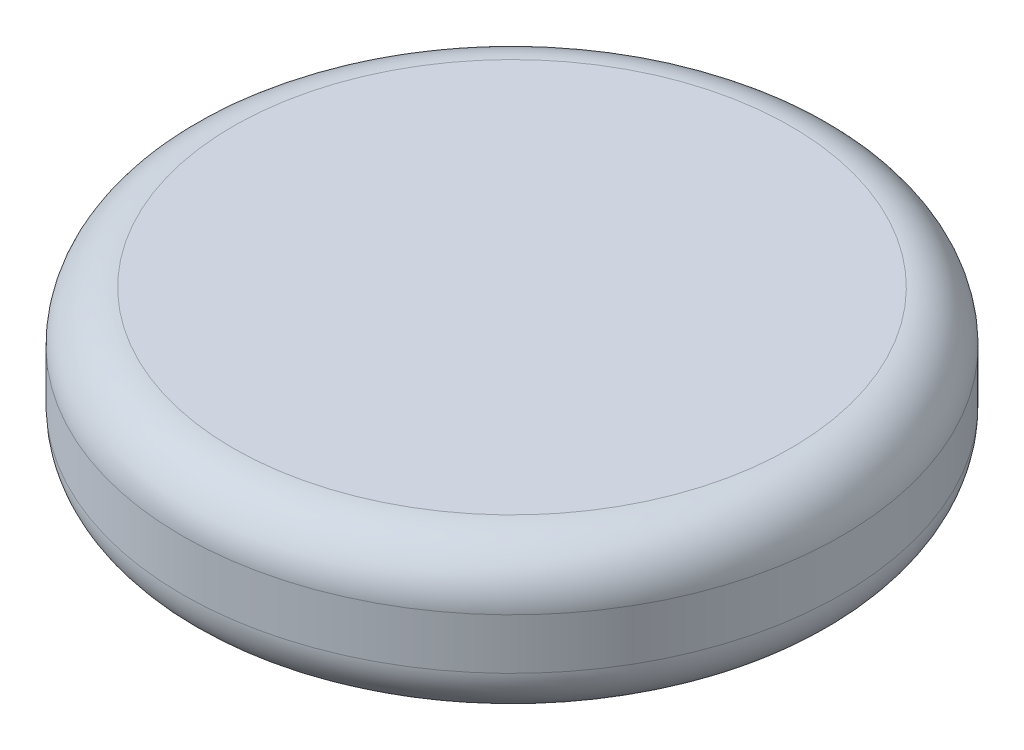
ISO-10303-21;
HEADER;
FILE_DESCRIPTION(('STEP AP214'),'2;1');
FILE_NAME('part.step','',(''),(''),'','','');
FILE_SCHEMA(('AUTOMOTIVE_DESIGN { 1 0 10303 214 1 1 1 1 }'));
ENDSEC;
DATA;
#1=APPLICATION_CONTEXT('core data for automotive mechanical design processes');
#2=APPLICATION_PROTOCOL_DEFINITION('international standard','automotive_design',2000,#1);
#3=PRODUCT_CONTEXT('',#1,'mechanical');
#4=PRODUCT('Part','Part','',(#3));
#5=PRODUCT_RELATED_PRODUCT_CATEGORY('part','',(#4));
#6=PRODUCT_DEFINITION_FORMATION('','',#4);
#7=PRODUCT_DEFINITION_CONTEXT('part definition',#1,'design');
#8=PRODUCT_DEFINITION('design','',#6,#7);
#9=PRODUCT_DEFINITION_SHAPE('','',#8);
#10=(LENGTH_UNIT() NAMED_UNIT(*) SI_UNIT(.MILLI.,.METRE.));
#11=(NAMED_UNIT(*) PLANE_ANGLE_UNIT() SI_UNIT($,.RADIAN.));
#12=(NAMED_UNIT(*) SI_UNIT($,.STERADIAN.) SOLID_ANGLE_UNIT());
#13=UNCERTAINTY_MEASURE_WITH_UNIT(LENGTH_MEASURE(1.E-05),#10,'distance_accuracy_value','');
#14=(GEOMETRIC_REPRESENTATION_CONTEXT(3) GLOBAL_UNCERTAINTY_ASSIGNED_CONTEXT((#13)) GLOBAL_UNIT_ASSIGNED_CONTEXT((#10,
#11,#12)) REPRESENTATION_CONTEXT('',''));
#15=CARTESIAN_POINT('',(0.,0.,0.));
#16=DIRECTION('',(0.,0.,1.));
#17=DIRECTION('',(1.,0.,0.));
#18=AXIS2_PLACEMENT_3D('',#15,#16,#17);
#19=CARTESIAN_POINT('',(0.,19.05,0.));
#20=DIRECTION('',(0.,-1.,0.));
#21=DIRECTION('',(0.,0.,-1.));
#22=AXIS2_PLACEMENT_3D('',#19,#20,#21);
#23=CYLINDRICAL_SURFACE('',#22,41.275);
#24=CARTESIAN_POINT('',(0.,6.35,0.));
#25=DIRECTION('',(0.,1.,0.));
#26=DIRECTION('',(0.,0.,1.));
#27=AXIS2_PLACEMENT_3D('',#24,#25,#26);
#28=CIRCLE('',#27,41.275);
#29=CARTESIAN_POINT('',(0.,6.35,-41.275));
#30=VERTEX_POINT('',#29);
#31=EDGE_CURVE('E50',#30,#30,#28,.T.);
#32=CARTESIAN_POINT('',(0.,12.7,0.));
#33=DIRECTION('',(0.,1.,0.));
#34=DIRECTION('',(0.,0.,1.));
#35=AXIS2_PLACEMENT_3D('',#32,#33,#34);
#36=CIRCLE('',#35,41.275);
#37=CARTESIAN_POINT('',(0.,12.7,-41.275));
#38=VERTEX_POINT('',#37);
#39=EDGE_CURVE('E55',#38,#38,#36,.F.);
#40=CARTESIAN_POINT('',(0.,6.35,-41.275));
#41=CARTESIAN_POINT('',(0.,6.41614583333333,-41.275));
#42=CARTESIAN_POINT('',(0.,6.48229166666666,-41.275));
#43=CARTESIAN_POINT('',(0.,6.61458333333333,-41.275));
#44=CARTESIAN_POINT('',(0.,6.68072916666666,-41.275));
#45=CARTESIAN_POINT('',(0.,6.81302083333333,-41.275));
#46=CARTESIAN_POINT('',(0.,6.87916666666666,-41.275));
#47=CARTESIAN_POINT('',(0.,7.01145833333333,-41.275));
#48=CARTESIAN_POINT('',(0.,7.07760416666666,-41.275));
#49=CARTESIAN_POINT('',(0.,7.20989583333333,-41.275));
#50=CARTESIAN_POINT('',(0.,7.27604166666666,-41.275));
#51=CARTESIAN_POINT('',(0.,7.40833333333333,-41.275));
#52=CARTESIAN_POINT('',(0.,7.47447916666666,-41.275));
#53=CARTESIAN_POINT('',(0.,7.60677083333333,-41.275));
#54=CARTESIAN_POINT('',(0.,7.67291666666666,-41.275));
#55=CARTESIAN_POINT('',(0.,7.80520833333333,-41.275));
#56=CARTESIAN_POINT('',(0.,7.87135416666667,-41.275));
#57=CARTESIAN_POINT('',(0.,8.00364583333333,-41.275));
#58=CARTESIAN_POINT('',(0.,8.06979166666666,-41.275));
#59=CARTESIAN_POINT('',(0.,8.20208333333333,-41.275));
#60=CARTESIAN_POINT('',(0.,8.26822916666666,-41.275));
#61=CARTESIAN_POINT('',(0.,8.40052083333333,-41.275));
#62=CARTESIAN_POINT('',(0.,8.46666666666667,-41.275));
#63=CARTESIAN_POINT('',(0.,8.59895833333333,-41.275));
#64=CARTESIAN_POINT('',(0.,8.66510416666666,-41.275));
#65=CARTESIAN_POINT('',(0.,8.79739583333333,-41.275));
#66=CARTESIAN_POINT('',(0.,8.86354166666666,-41.275));
#67=CARTESIAN_POINT('',(0.,8.99583333333333,-41.275));
#68=CARTESIAN_POINT('',(0.,9.06197916666667,-41.275));
#69=CARTESIAN_POINT('',(0.,9.19427083333333,-41.275));
#70=CARTESIAN_POINT('',(0.,9.26041666666666,-41.275));
#71=CARTESIAN_POINT('',(0.,9.39270833333333,-41.275));
#72=CARTESIAN_POINT('',(0.,9.45885416666667,-41.275));
#73=CARTESIAN_POINT('',(0.,9.59114583333333,-41.275));
#74=CARTESIAN_POINT('',(0.,9.65729166666667,-41.275));
#75=CARTESIAN_POINT('',(0.,9.78958333333333,-41.275));
#76=CARTESIAN_POINT('',(0.,9.85572916666666,-41.275));
#77=CARTESIAN_POINT('',(0.,9.98802083333333,-41.275));
#78=CARTESIAN_POINT('',(0.,10.0541666666667,-41.275));
#79=CARTESIAN_POINT('',(0.,10.1864583333333,-41.275));
#80=CARTESIAN_POINT('',(0.,10.2526041666667,-41.275));
#81=CARTESIAN_POINT('',(0.,10.3848958333333,-41.275));
#82=CARTESIAN_POINT('',(0.,10.4510416666667,-41.275));
#83=CARTESIAN_POINT('',(0.,10.5833333333333,-41.275));
#84=CARTESIAN_POINT('',(0.,10.6494791666667,-41.275));
#85=CARTESIAN_POINT('',(0.,10.7817708333333,-41.275));
#86=CARTESIAN_POINT('',(0.,10.8479166666667,-41.275));
#87=CARTESIAN_POINT('',(0.,10.9802083333333,-41.275));
#88=CARTESIAN_POINT('',(0.,11.0463541666667,-41.275));
#89=CARTESIAN_POINT('',(0.,11.1786458333333,-41.275));
#90=CARTESIAN_POINT('',(0.,11.2447916666667,-41.275));
#91=CARTESIAN_POINT('',(0.,11.3770833333333,-41.275));
#92=CARTESIAN_POINT('',(0.,11.4432291666667,-41.275));
#93=CARTESIAN_POINT('',(0.,11.5755208333333,-41.275));
#94=CARTESIAN_POINT('',(0.,11.6416666666667,-41.275));
#95=CARTESIAN_POINT('',(0.,11.7739583333333,-41.275));
#96=CARTESIAN_POINT('',(0.,11.8401041666667,-41.275));
#97=CARTESIAN_POINT('',(0.,11.9723958333333,-41.275));
#98=CARTESIAN_POINT('',(0.,12.0385416666667,-41.275));
#99=CARTESIAN_POINT('',(0.,12.1708333333333,-41.275));
#100=CARTESIAN_POINT('',(0.,12.2369791666667,-41.275));
#101=CARTESIAN_POINT('',(0.,12.3692708333333,-41.275));
#102=CARTESIAN_POINT('',(0.,12.4354166666667,-41.275));
#103=CARTESIAN_POINT('',(0.,12.5677083333333,-41.275));
#104=CARTESIAN_POINT('',(0.,12.6338541666667,-41.275));
#105=CARTESIAN_POINT('',(0.,12.7,-41.275));
#106=B_SPLINE_CURVE_WITH_KNOTS('',3,(#40,#41,#42,#43,#44,#45,#46,#47,#48,#49,#50,#51,#52,#53,
#54,#55,#56,#57,#58,#59,#60,#61,#62,#63,#64,#65,#66,#67,#68,#69,#70,#71,#72,#73,#74,#75,#76,#77,
#78,#79,#80,#81,#82,#83,#84,#85,#86,#87,#88,#89,#90,#91,#92,#93,#94,#95,#96,#97,#98,#99,#100,
#101,#102,#103,#104,#105),.UNSPECIFIED.,.F.,.F.,(4,2,2,2,2,2,2,2,2,2,2,2,2,2,2,2,2,2,2,2,2,2,2,
2,2,2,2,2,2,2,2,2,4),(0.,0.198437500000001,0.396875,0.5953125,0.793750000000001,
0.992187500000002,1.190625,1.3890625,1.5875,1.7859375,1.984375,2.1828125,2.38125,2.5796875,
2.778125,2.9765625,3.175,3.3734375,3.571875,3.7703125,3.96875,4.1671875,4.365625,4.5640625,
4.7625,4.9609375,5.159375,5.3578125,5.55625,5.7546875,5.953125,6.1515625,6.35),.UNSPECIFIED.);
#107=EDGE_CURVE('BSEAM37',#30,#38,#106,.T.);
#108=ORIENTED_EDGE('',*,*,#31,.T.);
#109=ORIENTED_EDGE('',*,*,#39,.T.);
#110=ORIENTED_EDGE('',*,*,#107,.T.);
#111=ORIENTED_EDGE('',*,*,#107,.F.);
#112=EDGE_LOOP('',(#108,#110,#109,#111));
#113=FACE_BOUND('',#112,.T.);
#114=ADVANCED_FACE('F37',(#113),#23,.T.);
#115=CARTESIAN_POINT('',(0.,19.05,0.));
#116=DIRECTION('',(0.,1.,0.));
#117=DIRECTION('',(0.,0.,1.));
#118=AXIS2_PLACEMENT_3D('',#115,#116,#117);
#119=PLANE('',#118);
#120=CARTESIAN_POINT('',(0.,19.05,0.));
#121=DIRECTION('',(0.,1.,0.));
#122=DIRECTION('',(0.,0.,1.));
#123=AXIS2_PLACEMENT_3D('',#120,#121,#122);
#124=CIRCLE('',#123,34.925);
#125=CARTESIAN_POINT('',(0.,19.05,34.925));
#126=VERTEX_POINT('',#125);
#127=EDGE_CURVE('E10',#126,#126,#124,.T.);
#128=ORIENTED_EDGE('',*,*,#127,.T.);
#129=EDGE_LOOP('',(#128));
#130=FACE_BOUND('',#129,.T.);
#131=ADVANCED_FACE('F72',(#130),#119,.T.);
#132=CARTESIAN_POINT('',(0.,0.,0.));
#133=DIRECTION('',(0.,1.,0.));
#134=DIRECTION('',(0.,0.,1.));
#135=AXIS2_PLACEMENT_3D('',#132,#133,#134);
#136=PLANE('',#135);
#137=CARTESIAN_POINT('',(0.,0.,0.));
#138=DIRECTION('',(0.,1.,0.));
#139=DIRECTION('',(0.,0.,1.));
#140=AXIS2_PLACEMENT_3D('',#137,#138,#139);
#141=CIRCLE('',#140,34.925);
#142=CARTESIAN_POINT('',(0.,0.,34.925));
#143=VERTEX_POINT('',#142);
#144=EDGE_CURVE('E45',#143,#143,#141,.F.);
#145=ORIENTED_EDGE('',*,*,#144,.T.);
#146=EDGE_LOOP('',(#145));
#147=FACE_BOUND('',#146,.T.);
#148=ADVANCED_FACE('F69',(#147),#136,.F.);
#149=CARTESIAN_POINT('',(0.,6.35,0.));
#150=DIRECTION('',(0.,1.,0.));
#151=DIRECTION('',(0.,0.,1.));
#152=AXIS2_PLACEMENT_3D('',#149,#150,#151);
#153=TOROIDAL_SURFACE('',#152,34.925,6.35);
#154=ORIENTED_EDGE('',*,*,#144,.F.);
#155=EDGE_LOOP('',(#154));
#156=FACE_BOUND('',#155,.T.);
#157=ORIENTED_EDGE('',*,*,#31,.F.);
#158=EDGE_LOOP('',(#157));
#159=FACE_BOUND('',#158,.T.);
#160=ADVANCED_FACE('F65',(#156,#159),#153,.T.);
#161=CARTESIAN_POINT('',(0.,12.7,0.));
#162=DIRECTION('',(0.,1.,0.));
#163=DIRECTION('',(0.,0.,1.));
#164=AXIS2_PLACEMENT_3D('',#161,#162,#163);
#165=TOROIDAL_SURFACE('',#164,34.925,6.35);
#166=ORIENTED_EDGE('',*,*,#39,.F.);
#167=EDGE_LOOP('',(#166));
#168=FACE_BOUND('',#167,.T.);
#169=ORIENTED_EDGE('',*,*,#127,.F.);
#170=EDGE_LOOP('',(#169));
#171=FACE_BOUND('',#170,.T.);
#172=ADVANCED_FACE('F39',(#168,#171),#165,.T.);
#173=CLOSED_SHELL('',(#114,#131,#148,#160,#172));
#174=MANIFOLD_SOLID_BREP('B2',#173);
#175=ADVANCED_BREP_SHAPE_REPRESENTATION('',(#18,#174),#14);
#176=SHAPE_DEFINITION_REPRESENTATION(#9,#175);
ENDSEC;
END-ISO-10303-21;
